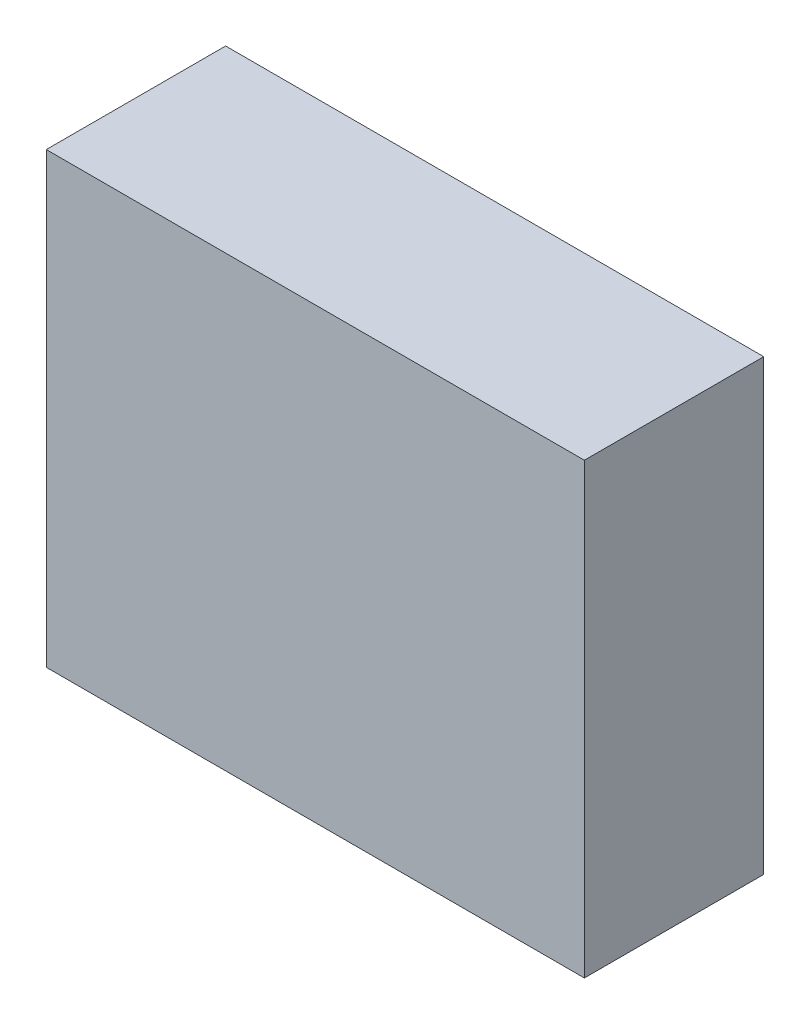
ISO-10303-21;
HEADER;
FILE_DESCRIPTION(('STEP AP214'),'2;1');
FILE_NAME('part.step','',(''),(''),'','','');
FILE_SCHEMA(('AUTOMOTIVE_DESIGN { 1 0 10303 214 1 1 1 1 }'));
ENDSEC;
DATA;
#1=APPLICATION_CONTEXT('core data for automotive mechanical design processes');
#2=APPLICATION_PROTOCOL_DEFINITION('international standard','automotive_design',2000,#1);
#3=PRODUCT_CONTEXT('',#1,'mechanical');
#4=PRODUCT('Part','Part','',(#3));
#5=PRODUCT_RELATED_PRODUCT_CATEGORY('part','',(#4));
#6=PRODUCT_DEFINITION_FORMATION('','',#4);
#7=PRODUCT_DEFINITION_CONTEXT('part definition',#1,'design');
#8=PRODUCT_DEFINITION('design','',#6,#7);
#9=PRODUCT_DEFINITION_SHAPE('','',#8);
#10=(LENGTH_UNIT() NAMED_UNIT(*) SI_UNIT(.MILLI.,.METRE.));
#11=(NAMED_UNIT(*) PLANE_ANGLE_UNIT() SI_UNIT($,.RADIAN.));
#12=(NAMED_UNIT(*) SI_UNIT($,.STERADIAN.) SOLID_ANGLE_UNIT());
#13=UNCERTAINTY_MEASURE_WITH_UNIT(LENGTH_MEASURE(1.E-05),#10,'distance_accuracy_value','');
#14=(GEOMETRIC_REPRESENTATION_CONTEXT(3) GLOBAL_UNCERTAINTY_ASSIGNED_CONTEXT((#13)) GLOBAL_UNIT_ASSIGNED_CONTEXT((#10,
#11,#12)) REPRESENTATION_CONTEXT('',''));
#15=CARTESIAN_POINT('',(0.,0.,0.));
#16=DIRECTION('',(0.,0.,1.));
#17=DIRECTION('',(1.,0.,0.));
#18=AXIS2_PLACEMENT_3D('',#15,#16,#17);
#19=CARTESIAN_POINT('',(-30.,40.,10.));
#20=DIRECTION('',(1.,0.,0.));
#21=DIRECTION('',(0.,0.,-1.));
#22=AXIS2_PLACEMENT_3D('',#19,#20,#21);
#23=PLANE('',#22);
#24=DIRECTION('',(0.,-1.,0.));
#25=VECTOR('',#24,1.);
#26=CARTESIAN_POINT('',(-30.,40.,-10.));
#27=LINE('',#26,#25);
#28=CARTESIAN_POINT('',(-30.,40.,-10.));
#29=VERTEX_POINT('',#28);
#30=CARTESIAN_POINT('',(-30.,-10.,-10.));
#31=VERTEX_POINT('',#30);
#32=EDGE_CURVE('E108',#29,#31,#27,.T.);
#33=ORIENTED_EDGE('',*,*,#32,.T.);
#34=DIRECTION('',(0.,0.,-1.));
#35=VECTOR('',#34,1.);
#36=CARTESIAN_POINT('',(-30.,-10.,10.));
#37=LINE('',#36,#35);
#38=CARTESIAN_POINT('',(-30.,-10.,10.));
#39=VERTEX_POINT('',#38);
#40=EDGE_CURVE('E144',#39,#31,#37,.T.);
#41=ORIENTED_EDGE('',*,*,#40,.F.);
#42=DIRECTION('',(0.,-1.,0.));
#43=VECTOR('',#42,1.);
#44=CARTESIAN_POINT('',(-30.,40.,10.));
#45=LINE('',#44,#43);
#46=CARTESIAN_POINT('',(-30.,40.,10.));
#47=VERTEX_POINT('',#46);
#48=EDGE_CURVE('E118',#47,#39,#45,.T.);
#49=ORIENTED_EDGE('',*,*,#48,.F.);
#50=DIRECTION('',(0.,0.,-1.));
#51=VECTOR('',#50,1.);
#52=CARTESIAN_POINT('',(-30.,40.,10.));
#53=LINE('',#52,#51);
#54=EDGE_CURVE('E128',#47,#29,#53,.T.);
#55=ORIENTED_EDGE('',*,*,#54,.T.);
#56=EDGE_LOOP('',(#33,#41,#49,#55));
#57=FACE_BOUND('',#56,.T.);
#58=ADVANCED_FACE('F41',(#57),#23,.F.);
#59=CARTESIAN_POINT('',(-30.,-10.,10.));
#60=DIRECTION('',(0.,1.,0.));
#61=DIRECTION('',(0.,0.,1.));
#62=AXIS2_PLACEMENT_3D('',#59,#60,#61);
#63=PLANE('',#62);
#64=DIRECTION('',(1.,0.,0.));
#65=VECTOR('',#64,1.);
#66=CARTESIAN_POINT('',(-30.,-10.,-10.));
#67=LINE('',#66,#65);
#68=CARTESIAN_POINT('',(30.,-10.,-10.));
#69=VERTEX_POINT('',#68);
#70=EDGE_CURVE('E131',#31,#69,#67,.T.);
#71=ORIENTED_EDGE('',*,*,#70,.T.);
#72=DIRECTION('',(0.,0.,-1.));
#73=VECTOR('',#72,1.);
#74=CARTESIAN_POINT('',(30.,-10.,10.));
#75=LINE('',#74,#73);
#76=CARTESIAN_POINT('',(30.,-10.,10.));
#77=VERTEX_POINT('',#76);
#78=EDGE_CURVE('E141',#77,#69,#75,.T.);
#79=ORIENTED_EDGE('',*,*,#78,.F.);
#80=DIRECTION('',(1.,0.,0.));
#81=VECTOR('',#80,1.);
#82=CARTESIAN_POINT('',(-30.,-10.,10.));
#83=LINE('',#82,#81);
#84=EDGE_CURVE('E121',#39,#77,#83,.T.);
#85=ORIENTED_EDGE('',*,*,#84,.F.);
#86=ORIENTED_EDGE('',*,*,#40,.T.);
#87=EDGE_LOOP('',(#71,#79,#85,#86));
#88=FACE_BOUND('',#87,.T.);
#89=ADVANCED_FACE('F163',(#88),#63,.F.);
#90=CARTESIAN_POINT('',(30.,-10.,10.));
#91=DIRECTION('',(-1.,0.,0.));
#92=DIRECTION('',(0.,0.,1.));
#93=AXIS2_PLACEMENT_3D('',#90,#91,#92);
#94=PLANE('',#93);
#95=DIRECTION('',(0.,1.,0.));
#96=VECTOR('',#95,1.);
#97=CARTESIAN_POINT('',(30.,-10.,-10.));
#98=LINE('',#97,#96);
#99=CARTESIAN_POINT('',(30.,40.,-10.));
#100=VERTEX_POINT('',#99);
#101=EDGE_CURVE('E133',#69,#100,#98,.T.);
#102=ORIENTED_EDGE('',*,*,#101,.T.);
#103=DIRECTION('',(0.,0.,-1.));
#104=VECTOR('',#103,1.);
#105=CARTESIAN_POINT('',(30.,40.,10.));
#106=LINE('',#105,#104);
#107=CARTESIAN_POINT('',(30.,40.,10.));
#108=VERTEX_POINT('',#107);
#109=EDGE_CURVE('E138',#108,#100,#106,.T.);
#110=ORIENTED_EDGE('',*,*,#109,.F.);
#111=DIRECTION('',(0.,1.,0.));
#112=VECTOR('',#111,1.);
#113=CARTESIAN_POINT('',(30.,-10.,10.));
#114=LINE('',#113,#112);
#115=EDGE_CURVE('E124',#77,#108,#114,.T.);
#116=ORIENTED_EDGE('',*,*,#115,.F.);
#117=ORIENTED_EDGE('',*,*,#78,.T.);
#118=EDGE_LOOP('',(#102,#110,#116,#117));
#119=FACE_BOUND('',#118,.T.);
#120=ADVANCED_FACE('F168',(#119),#94,.F.);
#121=CARTESIAN_POINT('',(30.,40.,10.));
#122=DIRECTION('',(0.,-1.,0.));
#123=DIRECTION('',(0.,0.,-1.));
#124=AXIS2_PLACEMENT_3D('',#121,#122,#123);
#125=PLANE('',#124);
#126=DIRECTION('',(-1.,0.,0.));
#127=VECTOR('',#126,1.);
#128=CARTESIAN_POINT('',(30.,40.,-10.));
#129=LINE('',#128,#127);
#130=EDGE_CURVE('E122',#100,#29,#129,.T.);
#131=ORIENTED_EDGE('',*,*,#130,.T.);
#132=ORIENTED_EDGE('',*,*,#54,.F.);
#133=DIRECTION('',(-1.,0.,0.));
#134=VECTOR('',#133,1.);
#135=CARTESIAN_POINT('',(30.,40.,10.));
#136=LINE('',#135,#134);
#137=EDGE_CURVE('E126',#108,#47,#136,.T.);
#138=ORIENTED_EDGE('',*,*,#137,.F.);
#139=ORIENTED_EDGE('',*,*,#109,.T.);
#140=EDGE_LOOP('',(#131,#132,#138,#139));
#141=FACE_BOUND('',#140,.T.);
#142=ADVANCED_FACE('F183',(#141),#125,.F.);
#143=CARTESIAN_POINT('',(0.,0.,10.));
#144=DIRECTION('',(0.,0.,1.));
#145=DIRECTION('',(1.,0.,0.));
#146=AXIS2_PLACEMENT_3D('',#143,#144,#145);
#147=PLANE('',#146);
#148=ORIENTED_EDGE('',*,*,#48,.T.);
#149=ORIENTED_EDGE('',*,*,#84,.T.);
#150=ORIENTED_EDGE('',*,*,#115,.T.);
#151=ORIENTED_EDGE('',*,*,#137,.T.);
#152=EDGE_LOOP('',(#148,#149,#150,#151));
#153=FACE_BOUND('',#152,.T.);
#154=ADVANCED_FACE('F179',(#153),#147,.T.);
#155=CARTESIAN_POINT('',(0.,0.,-10.));
#156=DIRECTION('',(0.,0.,1.));
#157=DIRECTION('',(1.,0.,0.));
#158=AXIS2_PLACEMENT_3D('',#155,#156,#157);
#159=PLANE('',#158);
#160=DIRECTION('',(0.,1.,0.));
#161=VECTOR('',#160,1.);
#162=CARTESIAN_POINT('',(-5.77350269189625,0.,-10.));
#163=LINE('',#162,#161);
#164=CARTESIAN_POINT('',(-5.77350269189625,0.,-10.));
#165=VERTEX_POINT('',#164);
#166=CARTESIAN_POINT('',(-5.77350269189626,30.,-10.));
#167=VERTEX_POINT('',#166);
#168=EDGE_CURVE('E147',#165,#167,#163,.T.);
#169=ORIENTED_EDGE('',*,*,#168,.F.);
#170=DIRECTION('',(1.,0.,0.));
#171=VECTOR('',#170,1.);
#172=CARTESIAN_POINT('',(0.,0.,-10.));
#173=LINE('',#172,#171);
#174=CARTESIAN_POINT('',(17.3205080756888,0.,-10.));
#175=VERTEX_POINT('',#174);
#176=EDGE_CURVE('E11',#165,#175,#173,.T.);
#177=ORIENTED_EDGE('',*,*,#176,.T.);
#178=DIRECTION('',(0.,-1.,0.));
#179=VECTOR('',#178,1.);
#180=CARTESIAN_POINT('',(17.3205080756888,0.,-10.));
#181=LINE('',#180,#179);
#182=CARTESIAN_POINT('',(17.3205080756888,30.,-10.));
#183=VERTEX_POINT('',#182);
#184=EDGE_CURVE('E48',#175,#183,#181,.F.);
#185=ORIENTED_EDGE('',*,*,#184,.T.);
#186=DIRECTION('',(-1.,0.,0.));
#187=VECTOR('',#186,1.);
#188=CARTESIAN_POINT('',(0.,30.,-10.));
#189=LINE('',#188,#187);
#190=EDGE_CURVE('E149',#183,#167,#189,.T.);
#191=ORIENTED_EDGE('',*,*,#190,.T.);
#192=EDGE_LOOP('',(#169,#177,#185,#191));
#193=FACE_BOUND('',#192,.T.);
#194=ORIENTED_EDGE('',*,*,#32,.F.);
#195=ORIENTED_EDGE('',*,*,#130,.F.);
#196=ORIENTED_EDGE('',*,*,#101,.F.);
#197=ORIENTED_EDGE('',*,*,#70,.F.);
#198=EDGE_LOOP('',(#194,#195,#196,#197));
#199=FACE_BOUND('',#198,.T.);
#200=ADVANCED_FACE('F150',(#193,#199),#159,.F.);
#201=CARTESIAN_POINT('',(-2.5,0.,-4.33012701892219));
#202=DIRECTION('',(0.,-1.,0.));
#203=DIRECTION('',(0.,0.,-1.));
#204=AXIS2_PLACEMENT_3D('',#201,#202,#203);
#205=PLANE('',#204);
#206=ORIENTED_EDGE('',*,*,#176,.F.);
#207=DIRECTION('',(-0.5,0.,-0.866025403784439));
#208=VECTOR('',#207,1.);
#209=CARTESIAN_POINT('',(-2.5,0.,-4.33012701892219));
#210=LINE('',#209,#208);
#211=CARTESIAN_POINT('',(-9.99999999999999,0.,-17.3205080756888));
#212=VERTEX_POINT('',#211);
#213=EDGE_CURVE('E94',#165,#212,#210,.T.);
#214=ORIENTED_EDGE('',*,*,#213,.T.);
#215=CARTESIAN_POINT('',(0.,0.,0.));
#216=DIRECTION('',(0.,-1.,0.));
#217=DIRECTION('',(0.,0.,-1.));
#218=AXIS2_PLACEMENT_3D('',#215,#216,#217);
#219=CIRCLE('',#218,20.);
#220=EDGE_CURVE('E97',#212,#175,#219,.T.);
#221=ORIENTED_EDGE('',*,*,#220,.T.);
#222=EDGE_LOOP('',(#206,#214,#221));
#223=FACE_BOUND('',#222,.T.);
#224=ADVANCED_FACE('F96',(#223),#205,.T.);
#225=CARTESIAN_POINT('',(0.,0.,0.));
#226=DIRECTION('',(0.,-1.,0.));
#227=DIRECTION('',(0.,0.,-1.));
#228=AXIS2_PLACEMENT_3D('',#225,#226,#227);
#229=CYLINDRICAL_SURFACE('',#228,20.);
#230=ORIENTED_EDGE('',*,*,#184,.F.);
#231=ORIENTED_EDGE('',*,*,#220,.F.);
#232=DIRECTION('',(0.,1.,0.));
#233=VECTOR('',#232,1.);
#234=CARTESIAN_POINT('',(-9.99999999999999,0.,-17.3205080756888));
#235=LINE('',#234,#233);
#236=CARTESIAN_POINT('',(-9.99999999999999,30.,-17.3205080756888));
#237=VERTEX_POINT('',#236);
#238=EDGE_CURVE('E101',#212,#237,#235,.T.);
#239=ORIENTED_EDGE('',*,*,#238,.T.);
#240=CARTESIAN_POINT('',(0.,30.,0.));
#241=DIRECTION('',(0.,-1.,0.));
#242=DIRECTION('',(0.,0.,-1.));
#243=AXIS2_PLACEMENT_3D('',#240,#241,#242);
#244=CIRCLE('',#243,20.);
#245=EDGE_CURVE('E109',#237,#183,#244,.T.);
#246=ORIENTED_EDGE('',*,*,#245,.T.);
#247=EDGE_LOOP('',(#230,#231,#239,#246));
#248=FACE_BOUND('',#247,.T.);
#249=ADVANCED_FACE('F105',(#248),#229,.T.);
#250=CARTESIAN_POINT('',(-9.99999999999999,30.,-17.3205080756888));
#251=DIRECTION('',(0.,1.,0.));
#252=DIRECTION('',(0.,0.,1.));
#253=AXIS2_PLACEMENT_3D('',#250,#251,#252);
#254=PLANE('',#253);
#255=ORIENTED_EDGE('',*,*,#190,.F.);
#256=ORIENTED_EDGE('',*,*,#245,.F.);
#257=DIRECTION('',(0.5,0.,0.866025403784439));
#258=VECTOR('',#257,1.);
#259=CARTESIAN_POINT('',(-9.99999999999999,30.,-17.3205080756888));
#260=LINE('',#259,#258);
#261=EDGE_CURVE('E113',#237,#167,#260,.T.);
#262=ORIENTED_EDGE('',*,*,#261,.T.);
#263=EDGE_LOOP('',(#255,#256,#262));
#264=FACE_BOUND('',#263,.T.);
#265=ADVANCED_FACE('F153',(#264),#254,.T.);
#266=CARTESIAN_POINT('',(0.,0.,0.));
#267=DIRECTION('',(0.866025403784439,0.,-0.5));
#268=DIRECTION('',(-0.5,0.,-0.866025403784439));
#269=AXIS2_PLACEMENT_3D('',#266,#267,#268);
#270=PLANE('',#269);
#271=ORIENTED_EDGE('',*,*,#213,.F.);
#272=ORIENTED_EDGE('',*,*,#168,.T.);
#273=ORIENTED_EDGE('',*,*,#261,.F.);
#274=ORIENTED_EDGE('',*,*,#238,.F.);
#275=EDGE_LOOP('',(#271,#272,#273,#274));
#276=FACE_BOUND('',#275,.T.);
#277=ADVANCED_FACE('F111',(#276),#270,.F.);
#278=CLOSED_SHELL('',(#58,#89,#120,#142,#154,#200,#224,#249,#265,#277));
#279=MANIFOLD_SOLID_BREP('B2',#278);
#280=ADVANCED_BREP_SHAPE_REPRESENTATION('',(#18,#279),#14);
#281=SHAPE_DEFINITION_REPRESENTATION(#9,#280);
ENDSEC;
END-ISO-10303-21;
